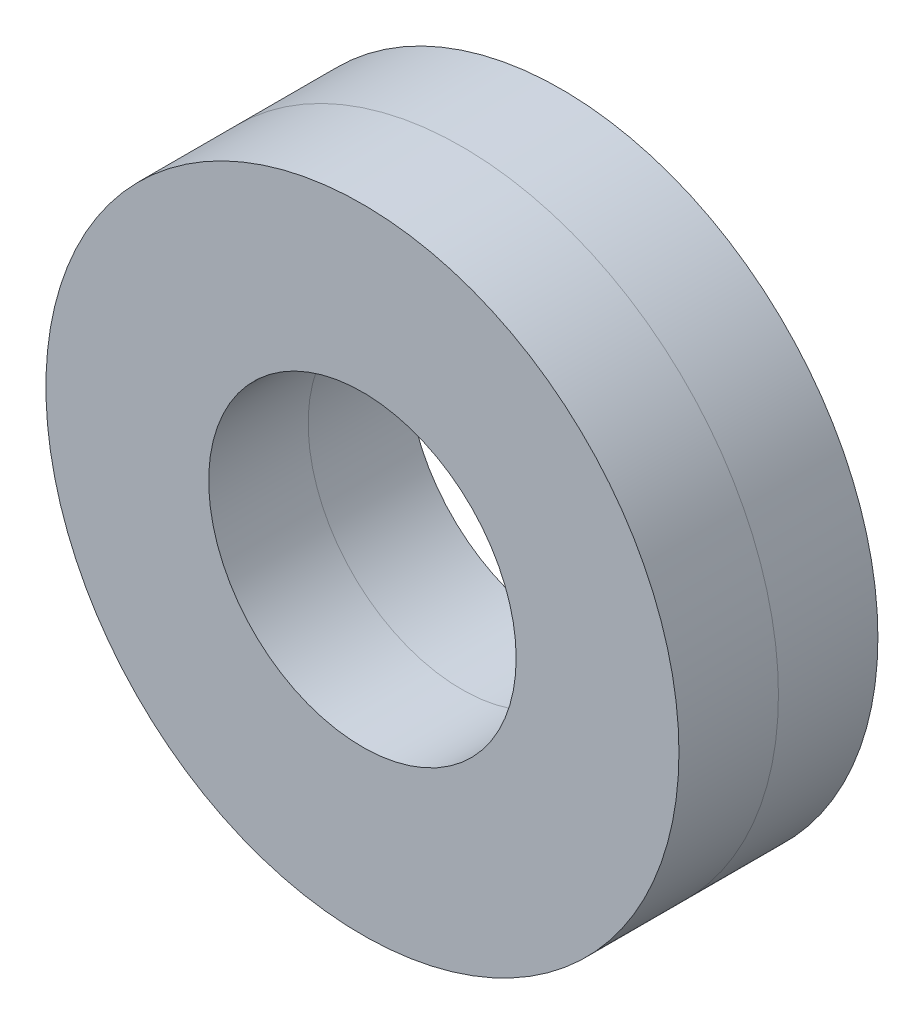
ISO-10303-21;
HEADER;
FILE_DESCRIPTION(('STEP AP214'),'2;1');
FILE_NAME('part.step','',(''),(''),'','','');
FILE_SCHEMA(('AUTOMOTIVE_DESIGN { 1 0 10303 214 1 1 1 1 }'));
ENDSEC;
DATA;
#1=APPLICATION_CONTEXT('core data for automotive mechanical design processes');
#2=APPLICATION_PROTOCOL_DEFINITION('international standard','automotive_design',2000,#1);
#3=PRODUCT_CONTEXT('',#1,'mechanical');
#4=PRODUCT('Part','Part','',(#3));
#5=PRODUCT_RELATED_PRODUCT_CATEGORY('part','',(#4));
#6=PRODUCT_DEFINITION_FORMATION('','',#4);
#7=PRODUCT_DEFINITION_CONTEXT('part definition',#1,'design');
#8=PRODUCT_DEFINITION('design','',#6,#7);
#9=PRODUCT_DEFINITION_SHAPE('','',#8);
#10=(LENGTH_UNIT() NAMED_UNIT(*) SI_UNIT(.MILLI.,.METRE.));
#11=(NAMED_UNIT(*) PLANE_ANGLE_UNIT() SI_UNIT($,.RADIAN.));
#12=(NAMED_UNIT(*) SI_UNIT($,.STERADIAN.) SOLID_ANGLE_UNIT());
#13=UNCERTAINTY_MEASURE_WITH_UNIT(LENGTH_MEASURE(1.E-05),#10,'distance_accuracy_value','');
#14=(GEOMETRIC_REPRESENTATION_CONTEXT(3) GLOBAL_UNCERTAINTY_ASSIGNED_CONTEXT((#13)) GLOBAL_UNIT_ASSIGNED_CONTEXT((#10,
#11,#12)) REPRESENTATION_CONTEXT('',''));
#15=CARTESIAN_POINT('',(0.,0.,0.));
#16=DIRECTION('',(0.,0.,1.));
#17=DIRECTION('',(1.,0.,0.));
#18=AXIS2_PLACEMENT_3D('',#15,#16,#17);
#19=CARTESIAN_POINT('',(0.,0.,0.));
#20=DIRECTION('',(0.,0.,1.));
#21=DIRECTION('',(1.,0.,0.));
#22=AXIS2_PLACEMENT_3D('',#19,#20,#21);
#23=CYLINDRICAL_SURFACE('',#22,1.7);
#24=CARTESIAN_POINT('',(0.,0.,0.));
#25=DIRECTION('',(0.,0.,1.));
#26=DIRECTION('',(1.,0.,0.));
#27=AXIS2_PLACEMENT_3D('',#24,#25,#26);
#28=CIRCLE('',#27,1.7);
#29=CARTESIAN_POINT('',(1.7,0.,0.));
#30=VERTEX_POINT('',#29);
#31=EDGE_CURVE('E78',#30,#30,#28,.T.);
#32=ORIENTED_EDGE('',*,*,#31,.T.);
#33=EDGE_LOOP('',(#32));
#34=FACE_BOUND('',#33,.T.);
#35=CARTESIAN_POINT('',(0.,0.,-1.1));
#36=DIRECTION('',(0.,0.,1.));
#37=DIRECTION('',(1.,0.,0.));
#38=AXIS2_PLACEMENT_3D('',#35,#36,#37);
#39=CIRCLE('',#38,1.7);
#40=CARTESIAN_POINT('',(1.7,0.,-1.1));
#41=VERTEX_POINT('',#40);
#42=EDGE_CURVE('E11',#41,#41,#39,.T.);
#43=ORIENTED_EDGE('',*,*,#42,.F.);
#44=EDGE_LOOP('',(#43));
#45=FACE_BOUND('',#44,.T.);
#46=ADVANCED_FACE('F57',(#34,#45),#23,.F.);
#47=CARTESIAN_POINT('',(0.,0.,-1.1));
#48=DIRECTION('',(0.,0.,-1.));
#49=DIRECTION('',(-1.,0.,0.));
#50=AXIS2_PLACEMENT_3D('',#47,#48,#49);
#51=PLANE('',#50);
#52=ORIENTED_EDGE('',*,*,#42,.T.);
#53=EDGE_LOOP('',(#52));
#54=FACE_BOUND('',#53,.T.);
#55=CARTESIAN_POINT('',(0.,0.,-1.1));
#56=DIRECTION('',(0.,0.,1.));
#57=DIRECTION('',(1.,0.,0.));
#58=AXIS2_PLACEMENT_3D('',#55,#56,#57);
#59=CIRCLE('',#58,3.5);
#60=CARTESIAN_POINT('',(3.5,0.,-1.1));
#61=VERTEX_POINT('',#60);
#62=EDGE_CURVE('E64',#61,#61,#59,.T.);
#63=ORIENTED_EDGE('',*,*,#62,.F.);
#64=EDGE_LOOP('',(#63));
#65=FACE_BOUND('',#64,.T.);
#66=ADVANCED_FACE('F97',(#54,#65),#51,.T.);
#67=CARTESIAN_POINT('',(0.,0.,0.));
#68=DIRECTION('',(0.,0.,1.));
#69=DIRECTION('',(1.,0.,0.));
#70=AXIS2_PLACEMENT_3D('',#67,#68,#69);
#71=CYLINDRICAL_SURFACE('',#70,3.5);
#72=ORIENTED_EDGE('',*,*,#62,.T.);
#73=EDGE_LOOP('',(#72));
#74=FACE_BOUND('',#73,.T.);
#75=CARTESIAN_POINT('',(0.,0.,0.));
#76=DIRECTION('',(0.,0.,1.));
#77=DIRECTION('',(1.,0.,0.));
#78=AXIS2_PLACEMENT_3D('',#75,#76,#77);
#79=CIRCLE('',#78,3.5);
#80=CARTESIAN_POINT('',(3.5,0.,0.));
#81=VERTEX_POINT('',#80);
#82=EDGE_CURVE('E71',#81,#81,#79,.T.);
#83=ORIENTED_EDGE('',*,*,#82,.F.);
#84=EDGE_LOOP('',(#83));
#85=FACE_BOUND('',#84,.T.);
#86=ADVANCED_FACE('F91',(#74,#85),#71,.T.);
#87=CARTESIAN_POINT('',(0.,0.,0.));
#88=DIRECTION('',(0.,0.,1.));
#89=DIRECTION('',(1.,0.,0.));
#90=AXIS2_PLACEMENT_3D('',#87,#88,#89);
#91=PLANE('',#90);
#92=ORIENTED_EDGE('',*,*,#82,.T.);
#93=EDGE_LOOP('',(#92));
#94=FACE_BOUND('',#93,.T.);
#95=ORIENTED_EDGE('',*,*,#31,.F.);
#96=EDGE_LOOP('',(#95));
#97=FACE_BOUND('',#96,.T.);
#98=ADVANCED_FACE('F89',(#94,#97),#91,.T.);
#99=CLOSED_SHELL('',(#46,#66,#86,#98));
#100=MANIFOLD_SOLID_BREP('B2',#99);
#101=CARTESIAN_POINT('',(0.,0.,0.));
#102=DIRECTION('',(0.,0.,1.));
#103=DIRECTION('',(1.,0.,0.));
#104=AXIS2_PLACEMENT_3D('',#101,#102,#103);
#105=CYLINDRICAL_SURFACE('',#104,3.5);
#106=CARTESIAN_POINT('',(0.,0.,0.));
#107=DIRECTION('',(0.,0.,1.));
#108=DIRECTION('',(1.,0.,0.));
#109=AXIS2_PLACEMENT_3D('',#106,#107,#108);
#110=CIRCLE('',#109,3.5);
#111=CARTESIAN_POINT('',(3.5,0.,0.));
#112=VERTEX_POINT('',#111);
#113=EDGE_CURVE('E156',#112,#112,#110,.T.);
#114=ORIENTED_EDGE('',*,*,#113,.T.);
#115=EDGE_LOOP('',(#114));
#116=FACE_BOUND('',#115,.T.);
#117=CARTESIAN_POINT('',(0.,0.,1.1));
#118=DIRECTION('',(0.,0.,1.));
#119=DIRECTION('',(1.,0.,0.));
#120=AXIS2_PLACEMENT_3D('',#117,#118,#119);
#121=CIRCLE('',#120,3.5);
#122=CARTESIAN_POINT('',(3.5,0.,1.1));
#123=VERTEX_POINT('',#122);
#124=EDGE_CURVE('E56',#123,#123,#121,.T.);
#125=ORIENTED_EDGE('',*,*,#124,.F.);
#126=EDGE_LOOP('',(#125));
#127=FACE_BOUND('',#126,.T.);
#128=ADVANCED_FACE('F135',(#116,#127),#105,.T.);
#129=CARTESIAN_POINT('',(0.,0.,1.1));
#130=DIRECTION('',(0.,0.,-1.));
#131=DIRECTION('',(-1.,0.,0.));
#132=AXIS2_PLACEMENT_3D('',#129,#130,#131);
#133=PLANE('',#132);
#134=CARTESIAN_POINT('',(0.,0.,1.1));
#135=DIRECTION('',(0.,0.,1.));
#136=DIRECTION('',(1.,0.,0.));
#137=AXIS2_PLACEMENT_3D('',#134,#135,#136);
#138=CIRCLE('',#137,1.7);
#139=CARTESIAN_POINT('',(1.7,0.,1.1));
#140=VERTEX_POINT('',#139);
#141=EDGE_CURVE('E142',#140,#140,#138,.T.);
#142=ORIENTED_EDGE('',*,*,#141,.F.);
#143=EDGE_LOOP('',(#142));
#144=FACE_BOUND('',#143,.T.);
#145=ORIENTED_EDGE('',*,*,#124,.T.);
#146=EDGE_LOOP('',(#145));
#147=FACE_BOUND('',#146,.T.);
#148=ADVANCED_FACE('F175',(#144,#147),#133,.F.);
#149=CARTESIAN_POINT('',(0.,0.,0.));
#150=DIRECTION('',(0.,0.,1.));
#151=DIRECTION('',(1.,0.,0.));
#152=AXIS2_PLACEMENT_3D('',#149,#150,#151);
#153=CYLINDRICAL_SURFACE('',#152,1.7);
#154=ORIENTED_EDGE('',*,*,#141,.T.);
#155=EDGE_LOOP('',(#154));
#156=FACE_BOUND('',#155,.T.);
#157=CARTESIAN_POINT('',(0.,0.,0.));
#158=DIRECTION('',(0.,0.,1.));
#159=DIRECTION('',(1.,0.,0.));
#160=AXIS2_PLACEMENT_3D('',#157,#158,#159);
#161=CIRCLE('',#160,1.7);
#162=CARTESIAN_POINT('',(1.7,0.,0.));
#163=VERTEX_POINT('',#162);
#164=EDGE_CURVE('E149',#163,#163,#161,.T.);
#165=ORIENTED_EDGE('',*,*,#164,.F.);
#166=EDGE_LOOP('',(#165));
#167=FACE_BOUND('',#166,.T.);
#168=ADVANCED_FACE('F170',(#156,#167),#153,.F.);
#169=CARTESIAN_POINT('',(0.,0.,0.));
#170=DIRECTION('',(0.,0.,1.));
#171=DIRECTION('',(1.,0.,0.));
#172=AXIS2_PLACEMENT_3D('',#169,#170,#171);
#173=PLANE('',#172);
#174=ORIENTED_EDGE('',*,*,#113,.F.);
#175=EDGE_LOOP('',(#174));
#176=FACE_BOUND('',#175,.T.);
#177=ORIENTED_EDGE('',*,*,#164,.T.);
#178=EDGE_LOOP('',(#177));
#179=FACE_BOUND('',#178,.T.);
#180=ADVANCED_FACE('F167',(#176,#179),#173,.F.);
#181=CLOSED_SHELL('',(#128,#148,#168,#180));
#182=MANIFOLD_SOLID_BREP('B6',#181);
#183=ADVANCED_BREP_SHAPE_REPRESENTATION('',(#18,#100,#182),#14);
#184=SHAPE_DEFINITION_REPRESENTATION(#9,#183);
ENDSEC;
END-ISO-10303-21;
